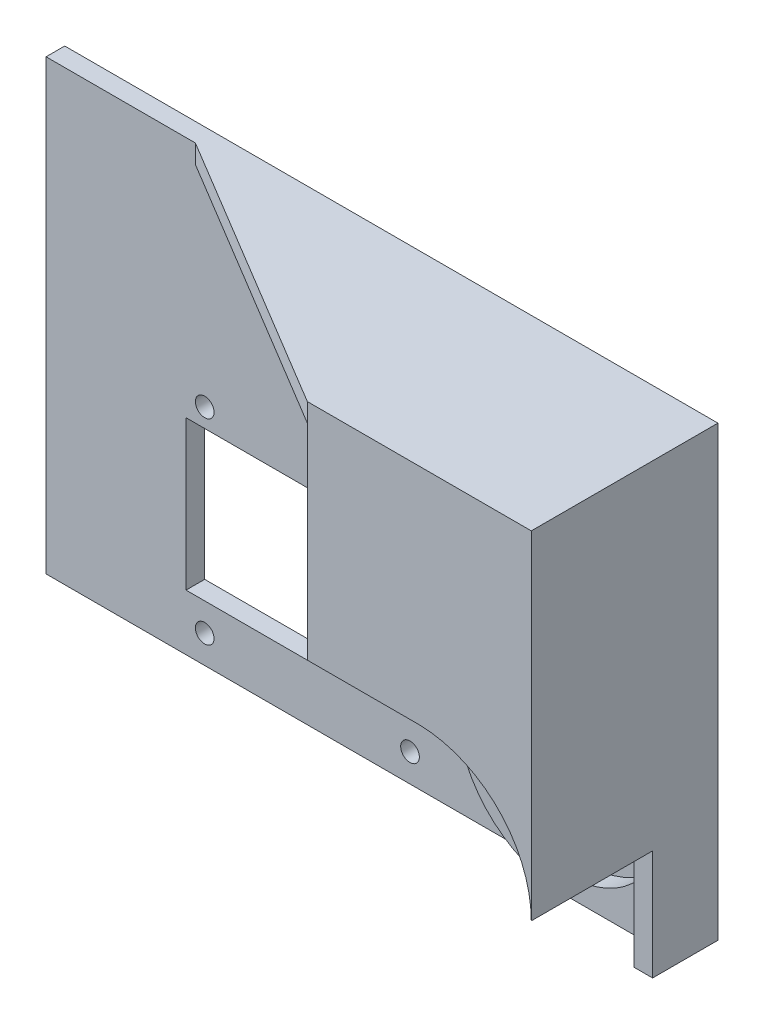
ISO-10303-21;
HEADER;
FILE_DESCRIPTION(('STEP AP214'),'2;1');
FILE_NAME('part.step','',(''),(''),'','','');
FILE_SCHEMA(('AUTOMOTIVE_DESIGN { 1 0 10303 214 1 1 1 1 }'));
ENDSEC;
DATA;
#1=APPLICATION_CONTEXT('core data for automotive mechanical design processes');
#2=APPLICATION_PROTOCOL_DEFINITION('international standard','automotive_design',2000,#1);
#3=PRODUCT_CONTEXT('',#1,'mechanical');
#4=PRODUCT('Part','Part','',(#3));
#5=PRODUCT_RELATED_PRODUCT_CATEGORY('part','',(#4));
#6=PRODUCT_DEFINITION_FORMATION('','',#4);
#7=PRODUCT_DEFINITION_CONTEXT('part definition',#1,'design');
#8=PRODUCT_DEFINITION('design','',#6,#7);
#9=PRODUCT_DEFINITION_SHAPE('','',#8);
#10=(LENGTH_UNIT() NAMED_UNIT(*) SI_UNIT(.MILLI.,.METRE.));
#11=(NAMED_UNIT(*) PLANE_ANGLE_UNIT() SI_UNIT($,.RADIAN.));
#12=(NAMED_UNIT(*) SI_UNIT($,.STERADIAN.) SOLID_ANGLE_UNIT());
#13=UNCERTAINTY_MEASURE_WITH_UNIT(LENGTH_MEASURE(1.E-05),#10,'distance_accuracy_value','');
#14=(GEOMETRIC_REPRESENTATION_CONTEXT(3) GLOBAL_UNCERTAINTY_ASSIGNED_CONTEXT((#13)) GLOBAL_UNIT_ASSIGNED_CONTEXT((#10,
#11,#12)) REPRESENTATION_CONTEXT('',''));
#15=CARTESIAN_POINT('',(0.,0.,0.));
#16=DIRECTION('',(0.,0.,1.));
#17=DIRECTION('',(1.,0.,0.));
#18=AXIS2_PLACEMENT_3D('',#15,#16,#17);
#19=CARTESIAN_POINT('',(58.,0.,2.));
#20=DIRECTION('',(-1.,0.,0.));
#21=DIRECTION('',(0.,-1.,0.));
#22=AXIS2_PLACEMENT_3D('',#19,#20,#21);
#23=PLANE('',#22);
#24=DIRECTION('',(0.,0.,1.));
#25=VECTOR('',#24,1.);
#26=CARTESIAN_POINT('',(58.,-36.2,7.));
#27=LINE('',#26,#25);
#28=CARTESIAN_POINT('',(58.,-36.2,7.));
#29=VERTEX_POINT('',#28);
#30=CARTESIAN_POINT('',(58.,-36.2,20.));
#31=VERTEX_POINT('',#30);
#32=EDGE_CURVE('E220',#29,#31,#27,.T.);
#33=ORIENTED_EDGE('',*,*,#32,.F.);
#34=DIRECTION('',(0.,1.,0.));
#35=VECTOR('',#34,1.);
#36=CARTESIAN_POINT('',(58.,-48.,7.));
#37=LINE('',#36,#35);
#38=CARTESIAN_POINT('',(58.,-48.,7.));
#39=VERTEX_POINT('',#38);
#40=EDGE_CURVE('E213',#39,#29,#37,.T.);
#41=ORIENTED_EDGE('',*,*,#40,.F.);
#42=DIRECTION('',(0.,0.,-1.));
#43=VECTOR('',#42,1.);
#44=CARTESIAN_POINT('',(58.,-48.,2.));
#45=LINE('',#44,#43);
#46=CARTESIAN_POINT('',(58.,-48.,0.));
#47=VERTEX_POINT('',#46);
#48=EDGE_CURVE('E463',#39,#47,#45,.T.);
#49=ORIENTED_EDGE('',*,*,#48,.T.);
#50=DIRECTION('',(0.,1.,0.));
#51=VECTOR('',#50,1.);
#52=CARTESIAN_POINT('',(58.,0.,0.));
#53=LINE('',#52,#51);
#54=CARTESIAN_POINT('',(58.,0.,0.));
#55=VERTEX_POINT('',#54);
#56=EDGE_CURVE('E188',#47,#55,#53,.T.);
#57=ORIENTED_EDGE('',*,*,#56,.T.);
#58=DIRECTION('',(0.,0.,-1.));
#59=VECTOR('',#58,1.);
#60=CARTESIAN_POINT('',(58.,0.,2.));
#61=LINE('',#60,#59);
#62=CARTESIAN_POINT('',(58.,0.,20.));
#63=VERTEX_POINT('',#62);
#64=EDGE_CURVE('E466',#63,#55,#61,.T.);
#65=ORIENTED_EDGE('',*,*,#64,.F.);
#66=DIRECTION('',(0.,1.,0.));
#67=VECTOR('',#66,1.);
#68=CARTESIAN_POINT('',(58.,0.,20.));
#69=LINE('',#68,#67);
#70=EDGE_CURVE('E356',#31,#63,#69,.T.);
#71=ORIENTED_EDGE('',*,*,#70,.F.);
#72=EDGE_LOOP('',(#33,#41,#49,#57,#65,#71));
#73=FACE_BOUND('',#72,.T.);
#74=ADVANCED_FACE('F36',(#73),#23,.F.);
#75=CARTESIAN_POINT('',(0.,0.,2.));
#76=DIRECTION('',(0.,0.,1.));
#77=DIRECTION('',(1.,0.,0.));
#78=AXIS2_PLACEMENT_3D('',#75,#76,#77);
#79=PLANE('',#78);
#80=CARTESIAN_POINT('',(27.,-45.,2.));
#81=DIRECTION('',(0.,0.,1.));
#82=DIRECTION('',(1.,0.,0.));
#83=AXIS2_PLACEMENT_3D('',#80,#81,#82);
#84=CIRCLE('',#83,1.);
#85=CARTESIAN_POINT('',(28.,-45.,2.));
#86=VERTEX_POINT('',#85);
#87=EDGE_CURVE('E438',#86,#86,#84,.T.);
#88=ORIENTED_EDGE('',*,*,#87,.F.);
#89=EDGE_LOOP('',(#88));
#90=FACE_BOUND('',#89,.T.);
#91=CARTESIAN_POINT('',(5.00000000000001,-24.,2.));
#92=DIRECTION('',(0.,0.,1.));
#93=DIRECTION('',(1.,0.,0.));
#94=AXIS2_PLACEMENT_3D('',#91,#92,#93);
#95=CIRCLE('',#94,1.);
#96=CARTESIAN_POINT('',(6.00000000000001,-24.,2.));
#97=VERTEX_POINT('',#96);
#98=EDGE_CURVE('E399',#97,#97,#95,.T.);
#99=ORIENTED_EDGE('',*,*,#98,.F.);
#100=EDGE_LOOP('',(#99));
#101=FACE_BOUND('',#100,.T.);
#102=CARTESIAN_POINT('',(27.,-24.,2.));
#103=DIRECTION('',(0.,0.,1.));
#104=DIRECTION('',(1.,0.,0.));
#105=AXIS2_PLACEMENT_3D('',#102,#103,#104);
#106=CIRCLE('',#105,1.);
#107=CARTESIAN_POINT('',(28.,-24.,2.));
#108=VERTEX_POINT('',#107);
#109=EDGE_CURVE('E400',#108,#108,#106,.T.);
#110=ORIENTED_EDGE('',*,*,#109,.F.);
#111=EDGE_LOOP('',(#110));
#112=FACE_BOUND('',#111,.T.);
#113=DIRECTION('',(0.,-1.,0.));
#114=VECTOR('',#113,1.);
#115=CARTESIAN_POINT('',(3.,-42.,2.));
#116=LINE('',#115,#114);
#117=CARTESIAN_POINT('',(3.,-26.,2.));
#118=VERTEX_POINT('',#117);
#119=CARTESIAN_POINT('',(3.,-42.,2.));
#120=VERTEX_POINT('',#119);
#121=EDGE_CURVE('E392',#118,#120,#116,.T.);
#122=ORIENTED_EDGE('',*,*,#121,.F.);
#123=DIRECTION('',(-1.,0.,0.));
#124=VECTOR('',#123,1.);
#125=CARTESIAN_POINT('',(3.,-26.,2.));
#126=LINE('',#125,#124);
#127=CARTESIAN_POINT('',(30.,-26.,2.));
#128=VERTEX_POINT('',#127);
#129=EDGE_CURVE('E408',#128,#118,#126,.T.);
#130=ORIENTED_EDGE('',*,*,#129,.F.);
#131=DIRECTION('',(0.,1.,0.));
#132=VECTOR('',#131,1.);
#133=CARTESIAN_POINT('',(30.,-42.,2.));
#134=LINE('',#133,#132);
#135=CARTESIAN_POINT('',(30.,-42.,2.));
#136=VERTEX_POINT('',#135);
#137=EDGE_CURVE('E422',#136,#128,#134,.T.);
#138=ORIENTED_EDGE('',*,*,#137,.F.);
#139=DIRECTION('',(1.,0.,0.));
#140=VECTOR('',#139,1.);
#141=CARTESIAN_POINT('',(3.,-42.,2.));
#142=LINE('',#141,#140);
#143=EDGE_CURVE('E419',#120,#136,#142,.T.);
#144=ORIENTED_EDGE('',*,*,#143,.F.);
#145=EDGE_LOOP('',(#122,#130,#138,#144));
#146=FACE_BOUND('',#145,.T.);
#147=CARTESIAN_POINT('',(5.00000000000001,-45.,2.));
#148=DIRECTION('',(0.,0.,1.));
#149=DIRECTION('',(1.,0.,0.));
#150=AXIS2_PLACEMENT_3D('',#147,#148,#149);
#151=CIRCLE('',#150,1.);
#152=CARTESIAN_POINT('',(6.00000000000001,-45.,2.));
#153=VERTEX_POINT('',#152);
#154=EDGE_CURVE('E437',#153,#153,#151,.T.);
#155=ORIENTED_EDGE('',*,*,#154,.F.);
#156=EDGE_LOOP('',(#155));
#157=FACE_BOUND('',#156,.T.);
#158=DIRECTION('',(1.,0.,0.));
#159=VECTOR('',#158,1.);
#160=CARTESIAN_POINT('',(0.,-48.,2.));
#161=LINE('',#160,#159);
#162=CARTESIAN_POINT('',(-12.,-48.,2.00000000000002));
#163=VERTEX_POINT('',#162);
#164=CARTESIAN_POINT('',(45.6033333333329,-48.,2.));
#165=VERTEX_POINT('',#164);
#166=EDGE_CURVE('E196',#163,#165,#161,.T.);
#167=ORIENTED_EDGE('',*,*,#166,.T.);
#168=CARTESIAN_POINT('',(45.8016666666667,-36.2,2.));
#169=DIRECTION('',(0.,0.,1.));
#170=DIRECTION('',(1.,0.,0.));
#171=AXIS2_PLACEMENT_3D('',#168,#169,#170);
#172=CIRCLE('',#171,11.8016666666667);
#173=CARTESIAN_POINT('',(34.,-36.2,2.));
#174=VERTEX_POINT('',#173);
#175=EDGE_CURVE('E234',#174,#165,#172,.T.);
#176=ORIENTED_EDGE('',*,*,#175,.F.);
#177=DIRECTION('',(-1.,0.,0.));
#178=VECTOR('',#177,1.);
#179=CARTESIAN_POINT('',(36.,-36.2,2.));
#180=LINE('',#179,#178);
#181=CARTESIAN_POINT('',(36.,-36.2,2.));
#182=VERTEX_POINT('',#181);
#183=EDGE_CURVE('E239',#182,#174,#180,.T.);
#184=ORIENTED_EDGE('',*,*,#183,.F.);
#185=CARTESIAN_POINT('',(46.,-35.9979591836735,2.));
#186=DIRECTION('',(0.,0.,-1.));
#187=DIRECTION('',(1.,0.,0.));
#188=AXIS2_PLACEMENT_3D('',#185,#186,#187);
#189=CIRCLE('',#188,10.0020408163265);
#190=CARTESIAN_POINT('',(56.,-36.2,2.));
#191=VERTEX_POINT('',#190);
#192=EDGE_CURVE('E248',#191,#182,#189,.T.);
#193=ORIENTED_EDGE('',*,*,#192,.F.);
#194=DIRECTION('',(0.,1.,0.));
#195=VECTOR('',#194,1.);
#196=CARTESIAN_POINT('',(56.,-48.,2.));
#197=LINE('',#196,#195);
#198=CARTESIAN_POINT('',(56.,-2.,2.));
#199=VERTEX_POINT('',#198);
#200=EDGE_CURVE('E377',#191,#199,#197,.T.);
#201=ORIENTED_EDGE('',*,*,#200,.T.);
#202=DIRECTION('',(1.,0.,0.));
#203=VECTOR('',#202,1.);
#204=CARTESIAN_POINT('',(4.,-2.,2.));
#205=LINE('',#204,#203);
#206=CARTESIAN_POINT('',(4.,-2.,2.));
#207=VERTEX_POINT('',#206);
#208=EDGE_CURVE('E390',#207,#199,#205,.T.);
#209=ORIENTED_EDGE('',*,*,#208,.F.);
#210=DIRECTION('',(0.,-1.,0.));
#211=VECTOR('',#210,1.);
#212=CARTESIAN_POINT('',(4.,0.,2.));
#213=LINE('',#212,#211);
#214=CARTESIAN_POINT('',(4.,0.,2.));
#215=VERTEX_POINT('',#214);
#216=EDGE_CURVE('E387',#215,#207,#213,.T.);
#217=ORIENTED_EDGE('',*,*,#216,.F.);
#218=DIRECTION('',(-1.,0.,0.));
#219=VECTOR('',#218,1.);
#220=CARTESIAN_POINT('',(0.,0.,2.));
#221=LINE('',#220,#219);
#222=CARTESIAN_POINT('',(-12.,0.,2.00000000000002));
#223=VERTEX_POINT('',#222);
#224=EDGE_CURVE('E452',#215,#223,#221,.T.);
#225=ORIENTED_EDGE('',*,*,#224,.T.);
#226=DIRECTION('',(0.,1.,0.));
#227=VECTOR('',#226,1.);
#228=CARTESIAN_POINT('',(-12.,0.,2.00000000000002));
#229=LINE('',#228,#227);
#230=EDGE_CURVE('E200',#163,#223,#229,.T.);
#231=ORIENTED_EDGE('',*,*,#230,.F.);
#232=EDGE_LOOP('',(#167,#176,#184,#193,#201,#209,#217,#225,#231));
#233=FACE_BOUND('',#232,.T.);
#234=ADVANCED_FACE('F286',(#90,#101,#112,#146,#157,#233),#79,.T.);
#235=CARTESIAN_POINT('',(56.,-48.,18.));
#236=DIRECTION('',(1.,0.,0.));
#237=DIRECTION('',(0.,1.,0.));
#238=AXIS2_PLACEMENT_3D('',#235,#236,#237);
#239=PLANE('',#238);
#240=DIRECTION('',(0.,1.,0.));
#241=VECTOR('',#240,1.);
#242=CARTESIAN_POINT('',(56.,-48.,7.));
#243=LINE('',#242,#241);
#244=CARTESIAN_POINT('',(56.,-48.,7.));
#245=VERTEX_POINT('',#244);
#246=CARTESIAN_POINT('',(56.,-29.5062217943327,7.));
#247=VERTEX_POINT('',#246);
#248=EDGE_CURVE('E231',#245,#247,#243,.T.);
#249=ORIENTED_EDGE('',*,*,#248,.T.);
#250=DIRECTION('',(0.,0.,1.));
#251=VECTOR('',#250,1.);
#252=CARTESIAN_POINT('',(56.,-29.5062217943327,7.));
#253=LINE('',#252,#251);
#254=CARTESIAN_POINT('',(56.,-29.5062217943327,18.));
#255=VERTEX_POINT('',#254);
#256=EDGE_CURVE('E226',#247,#255,#253,.T.);
#257=ORIENTED_EDGE('',*,*,#256,.T.);
#258=DIRECTION('',(0.,1.,0.));
#259=VECTOR('',#258,1.);
#260=CARTESIAN_POINT('',(56.,-48.,18.));
#261=LINE('',#260,#259);
#262=CARTESIAN_POINT('',(56.,-2.,18.));
#263=VERTEX_POINT('',#262);
#264=EDGE_CURVE('E373',#255,#263,#261,.T.);
#265=ORIENTED_EDGE('',*,*,#264,.T.);
#266=DIRECTION('',(0.,0.,-1.));
#267=VECTOR('',#266,1.);
#268=CARTESIAN_POINT('',(56.,-2.,18.));
#269=LINE('',#268,#267);
#270=EDGE_CURVE('E480',#263,#199,#269,.T.);
#271=ORIENTED_EDGE('',*,*,#270,.T.);
#272=ORIENTED_EDGE('',*,*,#200,.F.);
#273=DIRECTION('',(0.,0.,-1.));
#274=VECTOR('',#273,1.);
#275=CARTESIAN_POINT('',(56.,-36.2,4.));
#276=LINE('',#275,#274);
#277=CARTESIAN_POINT('',(56.,-36.2,4.));
#278=VERTEX_POINT('',#277);
#279=EDGE_CURVE('E253',#278,#191,#276,.T.);
#280=ORIENTED_EDGE('',*,*,#279,.F.);
#281=DIRECTION('',(0.,-1.,0.));
#282=VECTOR('',#281,1.);
#283=CARTESIAN_POINT('',(56.,-48.,4.));
#284=LINE('',#283,#282);
#285=CARTESIAN_POINT('',(56.,-48.,4.));
#286=VERTEX_POINT('',#285);
#287=EDGE_CURVE('E460',#278,#286,#284,.T.);
#288=ORIENTED_EDGE('',*,*,#287,.T.);
#289=DIRECTION('',(0.,0.,-1.));
#290=VECTOR('',#289,1.);
#291=CARTESIAN_POINT('',(56.,-48.,18.));
#292=LINE('',#291,#290);
#293=EDGE_CURVE('E60',#245,#286,#292,.T.);
#294=ORIENTED_EDGE('',*,*,#293,.F.);
#295=EDGE_LOOP('',(#249,#257,#265,#271,#272,#280,#288,#294));
#296=FACE_BOUND('',#295,.T.);
#297=ADVANCED_FACE('F282',(#296),#239,.F.);
#298=CARTESIAN_POINT('',(4.,-2.,20.));
#299=DIRECTION('',(0.,1.,0.));
#300=DIRECTION('',(-1.,0.,0.));
#301=AXIS2_PLACEMENT_3D('',#298,#299,#300);
#302=PLANE('',#301);
#303=DIRECTION('',(0.,0.,-1.));
#304=VECTOR('',#303,1.);
#305=CARTESIAN_POINT('',(34.,-2.,20.));
#306=LINE('',#305,#304);
#307=CARTESIAN_POINT('',(34.,-2.,20.));
#308=VERTEX_POINT('',#307);
#309=CARTESIAN_POINT('',(34.,-2.,18.));
#310=VERTEX_POINT('',#309);
#311=EDGE_CURVE('E370',#308,#310,#306,.T.);
#312=ORIENTED_EDGE('',*,*,#311,.F.);
#313=DIRECTION('',(-0.857492925712544,0.,-0.514495755427526));
#314=VECTOR('',#313,1.);
#315=CARTESIAN_POINT('',(4.,-2.,2.));
#316=LINE('',#315,#314);
#317=EDGE_CURVE('E381',#308,#207,#316,.T.);
#318=ORIENTED_EDGE('',*,*,#317,.T.);
#319=ORIENTED_EDGE('',*,*,#208,.T.);
#320=ORIENTED_EDGE('',*,*,#270,.F.);
#321=DIRECTION('',(1.,0.,0.));
#322=VECTOR('',#321,1.);
#323=CARTESIAN_POINT('',(56.,-2.,18.));
#324=LINE('',#323,#322);
#325=EDGE_CURVE('E482',#310,#263,#324,.T.);
#326=ORIENTED_EDGE('',*,*,#325,.F.);
#327=EDGE_LOOP('',(#312,#318,#319,#320,#326));
#328=FACE_BOUND('',#327,.T.);
#329=ADVANCED_FACE('F285',(#328),#302,.F.);
#330=CARTESIAN_POINT('',(0.,-48.,2.));
#331=DIRECTION('',(0.,1.,0.));
#332=DIRECTION('',(0.,0.,1.));
#333=AXIS2_PLACEMENT_3D('',#330,#331,#332);
#334=PLANE('',#333);
#335=ORIENTED_EDGE('',*,*,#48,.F.);
#336=DIRECTION('',(1.,0.,0.));
#337=VECTOR('',#336,1.);
#338=CARTESIAN_POINT('',(58.,-48.,7.));
#339=LINE('',#338,#337);
#340=EDGE_CURVE('E211',#245,#39,#339,.T.);
#341=ORIENTED_EDGE('',*,*,#340,.F.);
#342=ORIENTED_EDGE('',*,*,#293,.T.);
#343=DIRECTION('',(1.,0.,0.));
#344=VECTOR('',#343,1.);
#345=CARTESIAN_POINT('',(57.,-48.,4.));
#346=LINE('',#345,#344);
#347=CARTESIAN_POINT('',(46.,-48.,4.));
#348=VERTEX_POINT('',#347);
#349=EDGE_CURVE('E238',#348,#286,#346,.T.);
#350=ORIENTED_EDGE('',*,*,#349,.F.);
#351=DIRECTION('',(0.,0.,-1.));
#352=VECTOR('',#351,1.);
#353=CARTESIAN_POINT('',(46.,-48.,4.));
#354=LINE('',#353,#352);
#355=CARTESIAN_POINT('',(46.,-48.,2.));
#356=VERTEX_POINT('',#355);
#357=EDGE_CURVE('E255',#348,#356,#354,.T.);
#358=ORIENTED_EDGE('',*,*,#357,.T.);
#359=CARTESIAN_POINT('',(45.8016666666667,-36.2,2.));
#360=DIRECTION('',(0.,0.,1.));
#361=DIRECTION('',(-0.0168055359412902,-0.999858777008896,0.));
#362=AXIS2_PLACEMENT_3D('',#359,#360,#361);
#363=CIRCLE('',#362,11.8016666666667);
#364=EDGE_CURVE('E258',#165,#356,#363,.T.);
#365=ORIENTED_EDGE('',*,*,#364,.F.);
#366=ORIENTED_EDGE('',*,*,#166,.F.);
#367=DIRECTION('',(0.,0.,1.));
#368=VECTOR('',#367,1.);
#369=CARTESIAN_POINT('',(-12.,-48.,0.));
#370=LINE('',#369,#368);
#371=CARTESIAN_POINT('',(-12.,-48.,0.));
#372=VERTEX_POINT('',#371);
#373=EDGE_CURVE('E193',#372,#163,#370,.T.);
#374=ORIENTED_EDGE('',*,*,#373,.F.);
#375=DIRECTION('',(1.,0.,0.));
#376=VECTOR('',#375,1.);
#377=CARTESIAN_POINT('',(0.,-48.,0.));
#378=LINE('',#377,#376);
#379=EDGE_CURVE('E182',#372,#47,#378,.T.);
#380=ORIENTED_EDGE('',*,*,#379,.T.);
#381=EDGE_LOOP('',(#335,#341,#342,#350,#358,#365,#366,#374,#380));
#382=FACE_BOUND('',#381,.T.);
#383=ADVANCED_FACE('F38',(#382),#334,.F.);
#384=CARTESIAN_POINT('',(0.,0.,2.));
#385=DIRECTION('',(0.,-1.,0.));
#386=DIRECTION('',(0.,0.,-1.));
#387=AXIS2_PLACEMENT_3D('',#384,#385,#386);
#388=PLANE('',#387);
#389=ORIENTED_EDGE('',*,*,#224,.F.);
#390=DIRECTION('',(-0.857492925712544,0.,-0.514495755427526));
#391=VECTOR('',#390,1.);
#392=CARTESIAN_POINT('',(4.,0.,2.));
#393=LINE('',#392,#391);
#394=CARTESIAN_POINT('',(34.,0.,20.));
#395=VERTEX_POINT('',#394);
#396=EDGE_CURVE('E375',#395,#215,#393,.T.);
#397=ORIENTED_EDGE('',*,*,#396,.F.);
#398=DIRECTION('',(-1.,0.,0.));
#399=VECTOR('',#398,1.);
#400=CARTESIAN_POINT('',(4.,0.,20.));
#401=LINE('',#400,#399);
#402=EDGE_CURVE('E389',#63,#395,#401,.T.);
#403=ORIENTED_EDGE('',*,*,#402,.F.);
#404=ORIENTED_EDGE('',*,*,#64,.T.);
#405=DIRECTION('',(-1.,0.,0.));
#406=VECTOR('',#405,1.);
#407=CARTESIAN_POINT('',(0.,0.,0.));
#408=LINE('',#407,#406);
#409=CARTESIAN_POINT('',(-12.,0.,0.));
#410=VERTEX_POINT('',#409);
#411=EDGE_CURVE('E455',#55,#410,#408,.T.);
#412=ORIENTED_EDGE('',*,*,#411,.T.);
#413=DIRECTION('',(0.,0.,-1.));
#414=VECTOR('',#413,1.);
#415=CARTESIAN_POINT('',(-12.,0.,0.));
#416=LINE('',#415,#414);
#417=EDGE_CURVE('E205',#223,#410,#416,.T.);
#418=ORIENTED_EDGE('',*,*,#417,.F.);
#419=EDGE_LOOP('',(#389,#397,#403,#404,#412,#418));
#420=FACE_BOUND('',#419,.T.);
#421=ADVANCED_FACE('F344',(#420),#388,.F.);
#422=CARTESIAN_POINT('',(0.,0.,0.));
#423=DIRECTION('',(0.,0.,1.));
#424=DIRECTION('',(1.,0.,0.));
#425=AXIS2_PLACEMENT_3D('',#422,#423,#424);
#426=PLANE('',#425);
#427=CARTESIAN_POINT('',(27.,-45.,0.));
#428=DIRECTION('',(0.,0.,1.));
#429=DIRECTION('',(1.,0.,0.));
#430=AXIS2_PLACEMENT_3D('',#427,#428,#429);
#431=CIRCLE('',#430,1.);
#432=CARTESIAN_POINT('',(28.,-45.,0.));
#433=VERTEX_POINT('',#432);
#434=EDGE_CURVE('E434',#433,#433,#431,.T.);
#435=ORIENTED_EDGE('',*,*,#434,.T.);
#436=EDGE_LOOP('',(#435));
#437=FACE_BOUND('',#436,.T.);
#438=CARTESIAN_POINT('',(5.00000000000001,-24.,0.));
#439=DIRECTION('',(0.,0.,1.));
#440=DIRECTION('',(1.,0.,0.));
#441=AXIS2_PLACEMENT_3D('',#438,#439,#440);
#442=CIRCLE('',#441,1.);
#443=CARTESIAN_POINT('',(6.00000000000001,-24.,0.));
#444=VERTEX_POINT('',#443);
#445=EDGE_CURVE('E441',#444,#444,#442,.T.);
#446=ORIENTED_EDGE('',*,*,#445,.T.);
#447=EDGE_LOOP('',(#446));
#448=FACE_BOUND('',#447,.T.);
#449=CARTESIAN_POINT('',(27.,-24.,0.));
#450=DIRECTION('',(0.,0.,1.));
#451=DIRECTION('',(1.,0.,0.));
#452=AXIS2_PLACEMENT_3D('',#449,#450,#451);
#453=CIRCLE('',#452,1.);
#454=CARTESIAN_POINT('',(28.,-24.,0.));
#455=VERTEX_POINT('',#454);
#456=EDGE_CURVE('E396',#455,#455,#453,.T.);
#457=ORIENTED_EDGE('',*,*,#456,.T.);
#458=EDGE_LOOP('',(#457));
#459=FACE_BOUND('',#458,.T.);
#460=DIRECTION('',(-1.,0.,0.));
#461=VECTOR('',#460,1.);
#462=CARTESIAN_POINT('',(3.,-26.,0.));
#463=LINE('',#462,#461);
#464=CARTESIAN_POINT('',(30.,-26.,0.));
#465=VERTEX_POINT('',#464);
#466=CARTESIAN_POINT('',(3.,-26.,0.));
#467=VERTEX_POINT('',#466);
#468=EDGE_CURVE('E414',#465,#467,#463,.T.);
#469=ORIENTED_EDGE('',*,*,#468,.T.);
#470=DIRECTION('',(0.,-1.,0.));
#471=VECTOR('',#470,1.);
#472=CARTESIAN_POINT('',(3.,-42.,0.));
#473=LINE('',#472,#471);
#474=CARTESIAN_POINT('',(3.,-42.,0.));
#475=VERTEX_POINT('',#474);
#476=EDGE_CURVE('E404',#467,#475,#473,.T.);
#477=ORIENTED_EDGE('',*,*,#476,.T.);
#478=DIRECTION('',(1.,0.,0.));
#479=VECTOR('',#478,1.);
#480=CARTESIAN_POINT('',(3.,-42.,0.));
#481=LINE('',#480,#479);
#482=CARTESIAN_POINT('',(30.,-42.,0.));
#483=VERTEX_POINT('',#482);
#484=EDGE_CURVE('E407',#475,#483,#481,.T.);
#485=ORIENTED_EDGE('',*,*,#484,.T.);
#486=DIRECTION('',(0.,1.,0.));
#487=VECTOR('',#486,1.);
#488=CARTESIAN_POINT('',(30.,-42.,0.));
#489=LINE('',#488,#487);
#490=EDGE_CURVE('E411',#483,#465,#489,.T.);
#491=ORIENTED_EDGE('',*,*,#490,.T.);
#492=EDGE_LOOP('',(#469,#477,#485,#491));
#493=FACE_BOUND('',#492,.T.);
#494=CARTESIAN_POINT('',(5.00000000000001,-45.,0.));
#495=DIRECTION('',(0.,0.,1.));
#496=DIRECTION('',(1.,0.,0.));
#497=AXIS2_PLACEMENT_3D('',#494,#495,#496);
#498=CIRCLE('',#497,1.);
#499=CARTESIAN_POINT('',(6.00000000000001,-45.,0.));
#500=VERTEX_POINT('',#499);
#501=EDGE_CURVE('E190',#500,#500,#498,.T.);
#502=ORIENTED_EDGE('',*,*,#501,.T.);
#503=EDGE_LOOP('',(#502));
#504=FACE_BOUND('',#503,.T.);
#505=ORIENTED_EDGE('',*,*,#379,.F.);
#506=DIRECTION('',(0.,-1.,0.));
#507=VECTOR('',#506,1.);
#508=CARTESIAN_POINT('',(-12.,0.,0.));
#509=LINE('',#508,#507);
#510=EDGE_CURVE('E187',#410,#372,#509,.T.);
#511=ORIENTED_EDGE('',*,*,#510,.F.);
#512=ORIENTED_EDGE('',*,*,#411,.F.);
#513=ORIENTED_EDGE('',*,*,#56,.F.);
#514=EDGE_LOOP('',(#505,#511,#512,#513));
#515=FACE_BOUND('',#514,.T.);
#516=ADVANCED_FACE('F184',(#437,#448,#459,#493,#504,#515),#426,.F.);
#517=CARTESIAN_POINT('',(5.00000000000001,-45.,0.));
#518=DIRECTION('',(0.,0.,1.));
#519=DIRECTION('',(1.,0.,0.));
#520=AXIS2_PLACEMENT_3D('',#517,#518,#519);
#521=CYLINDRICAL_SURFACE('',#520,1.);
#522=ORIENTED_EDGE('',*,*,#501,.F.);
#523=EDGE_LOOP('',(#522));
#524=FACE_BOUND('',#523,.T.);
#525=ORIENTED_EDGE('',*,*,#154,.T.);
#526=EDGE_LOOP('',(#525));
#527=FACE_BOUND('',#526,.T.);
#528=ADVANCED_FACE('F328',(#524,#527),#521,.F.);
#529=CARTESIAN_POINT('',(3.,-42.,0.));
#530=DIRECTION('',(-1.,0.,0.));
#531=DIRECTION('',(0.,0.,1.));
#532=AXIS2_PLACEMENT_3D('',#529,#530,#531);
#533=PLANE('',#532);
#534=ORIENTED_EDGE('',*,*,#121,.T.);
#535=DIRECTION('',(0.,0.,1.));
#536=VECTOR('',#535,1.);
#537=CARTESIAN_POINT('',(3.,-42.,0.));
#538=LINE('',#537,#536);
#539=EDGE_CURVE('E417',#475,#120,#538,.T.);
#540=ORIENTED_EDGE('',*,*,#539,.F.);
#541=ORIENTED_EDGE('',*,*,#476,.F.);
#542=DIRECTION('',(0.,0.,1.));
#543=VECTOR('',#542,1.);
#544=CARTESIAN_POINT('',(3.,-26.,0.));
#545=LINE('',#544,#543);
#546=EDGE_CURVE('E403',#467,#118,#545,.T.);
#547=ORIENTED_EDGE('',*,*,#546,.T.);
#548=EDGE_LOOP('',(#534,#540,#541,#547));
#549=FACE_BOUND('',#548,.T.);
#550=ADVANCED_FACE('F318',(#549),#533,.F.);
#551=CARTESIAN_POINT('',(3.,-26.,0.));
#552=DIRECTION('',(0.,1.,0.));
#553=DIRECTION('',(0.,0.,1.));
#554=AXIS2_PLACEMENT_3D('',#551,#552,#553);
#555=PLANE('',#554);
#556=ORIENTED_EDGE('',*,*,#129,.T.);
#557=ORIENTED_EDGE('',*,*,#546,.F.);
#558=ORIENTED_EDGE('',*,*,#468,.F.);
#559=DIRECTION('',(0.,0.,1.));
#560=VECTOR('',#559,1.);
#561=CARTESIAN_POINT('',(30.,-26.,0.));
#562=LINE('',#561,#560);
#563=EDGE_CURVE('E428',#465,#128,#562,.T.);
#564=ORIENTED_EDGE('',*,*,#563,.T.);
#565=EDGE_LOOP('',(#556,#557,#558,#564));
#566=FACE_BOUND('',#565,.T.);
#567=ADVANCED_FACE('F314',(#566),#555,.F.);
#568=CARTESIAN_POINT('',(30.,-42.,0.));
#569=DIRECTION('',(1.,0.,0.));
#570=DIRECTION('',(0.,0.,-1.));
#571=AXIS2_PLACEMENT_3D('',#568,#569,#570);
#572=PLANE('',#571);
#573=ORIENTED_EDGE('',*,*,#137,.T.);
#574=ORIENTED_EDGE('',*,*,#563,.F.);
#575=ORIENTED_EDGE('',*,*,#490,.F.);
#576=DIRECTION('',(0.,0.,1.));
#577=VECTOR('',#576,1.);
#578=CARTESIAN_POINT('',(30.,-42.,0.));
#579=LINE('',#578,#577);
#580=EDGE_CURVE('E430',#483,#136,#579,.T.);
#581=ORIENTED_EDGE('',*,*,#580,.T.);
#582=EDGE_LOOP('',(#573,#574,#575,#581));
#583=FACE_BOUND('',#582,.T.);
#584=ADVANCED_FACE('F317',(#583),#572,.F.);
#585=CARTESIAN_POINT('',(3.,-42.,0.));
#586=DIRECTION('',(0.,-1.,0.));
#587=DIRECTION('',(0.,0.,-1.));
#588=AXIS2_PLACEMENT_3D('',#585,#586,#587);
#589=PLANE('',#588);
#590=ORIENTED_EDGE('',*,*,#143,.T.);
#591=ORIENTED_EDGE('',*,*,#580,.F.);
#592=ORIENTED_EDGE('',*,*,#484,.F.);
#593=ORIENTED_EDGE('',*,*,#539,.T.);
#594=EDGE_LOOP('',(#590,#591,#592,#593));
#595=FACE_BOUND('',#594,.T.);
#596=ADVANCED_FACE('F312',(#595),#589,.F.);
#597=CARTESIAN_POINT('',(27.,-24.,0.));
#598=DIRECTION('',(0.,0.,1.));
#599=DIRECTION('',(1.,0.,0.));
#600=AXIS2_PLACEMENT_3D('',#597,#598,#599);
#601=CYLINDRICAL_SURFACE('',#600,1.);
#602=ORIENTED_EDGE('',*,*,#456,.F.);
#603=EDGE_LOOP('',(#602));
#604=FACE_BOUND('',#603,.T.);
#605=ORIENTED_EDGE('',*,*,#109,.T.);
#606=EDGE_LOOP('',(#605));
#607=FACE_BOUND('',#606,.T.);
#608=ADVANCED_FACE('F308',(#604,#607),#601,.F.);
#609=CARTESIAN_POINT('',(5.00000000000001,-24.,0.));
#610=DIRECTION('',(0.,0.,1.));
#611=DIRECTION('',(1.,0.,0.));
#612=AXIS2_PLACEMENT_3D('',#609,#610,#611);
#613=CYLINDRICAL_SURFACE('',#612,1.);
#614=ORIENTED_EDGE('',*,*,#445,.F.);
#615=EDGE_LOOP('',(#614));
#616=FACE_BOUND('',#615,.T.);
#617=ORIENTED_EDGE('',*,*,#98,.T.);
#618=EDGE_LOOP('',(#617));
#619=FACE_BOUND('',#618,.T.);
#620=ADVANCED_FACE('F311',(#616,#619),#613,.F.);
#621=CARTESIAN_POINT('',(27.,-45.,0.));
#622=DIRECTION('',(0.,0.,1.));
#623=DIRECTION('',(1.,0.,0.));
#624=AXIS2_PLACEMENT_3D('',#621,#622,#623);
#625=CYLINDRICAL_SURFACE('',#624,1.);
#626=ORIENTED_EDGE('',*,*,#434,.F.);
#627=EDGE_LOOP('',(#626));
#628=FACE_BOUND('',#627,.T.);
#629=ORIENTED_EDGE('',*,*,#87,.T.);
#630=EDGE_LOOP('',(#629));
#631=FACE_BOUND('',#630,.T.);
#632=ADVANCED_FACE('F303',(#628,#631),#625,.F.);
#633=CARTESIAN_POINT('',(0.,0.,20.));
#634=DIRECTION('',(0.,0.,1.));
#635=DIRECTION('',(1.,0.,0.));
#636=AXIS2_PLACEMENT_3D('',#633,#634,#635);
#637=PLANE('',#636);
#638=DIRECTION('',(-1.,0.,0.));
#639=VECTOR('',#638,1.);
#640=CARTESIAN_POINT('',(34.,-24.,20.));
#641=LINE('',#640,#639);
#642=CARTESIAN_POINT('',(46.,-24.,20.));
#643=VERTEX_POINT('',#642);
#644=CARTESIAN_POINT('',(34.,-24.,20.));
#645=VERTEX_POINT('',#644);
#646=EDGE_CURVE('E214',#643,#645,#641,.T.);
#647=ORIENTED_EDGE('',*,*,#646,.F.);
#648=CARTESIAN_POINT('',(45.7983333333333,-36.2,20.));
#649=DIRECTION('',(0.,0.,1.));
#650=DIRECTION('',(-1.,0.,0.));
#651=AXIS2_PLACEMENT_3D('',#648,#649,#650);
#652=CIRCLE('',#651,12.2016666666667);
#653=EDGE_CURVE('E210',#31,#643,#652,.T.);
#654=ORIENTED_EDGE('',*,*,#653,.F.);
#655=ORIENTED_EDGE('',*,*,#70,.T.);
#656=ORIENTED_EDGE('',*,*,#402,.T.);
#657=DIRECTION('',(0.,1.,0.));
#658=VECTOR('',#657,1.);
#659=CARTESIAN_POINT('',(34.,-2.,20.));
#660=LINE('',#659,#658);
#661=EDGE_CURVE('E384',#308,#395,#660,.T.);
#662=ORIENTED_EDGE('',*,*,#661,.F.);
#663=DIRECTION('',(0.,1.,0.));
#664=VECTOR('',#663,1.);
#665=CARTESIAN_POINT('',(34.,-48.,20.));
#666=LINE('',#665,#664);
#667=EDGE_CURVE('E363',#645,#308,#666,.T.);
#668=ORIENTED_EDGE('',*,*,#667,.F.);
#669=EDGE_LOOP('',(#647,#654,#655,#656,#662,#668));
#670=FACE_BOUND('',#669,.T.);
#671=ADVANCED_FACE('F299',(#670),#637,.T.);
#672=CARTESIAN_POINT('',(4.,-2.,2.));
#673=DIRECTION('',(0.514495755427526,0.,-0.857492925712544));
#674=DIRECTION('',(-0.857492925712544,0.,-0.514495755427526));
#675=AXIS2_PLACEMENT_3D('',#672,#673,#674);
#676=PLANE('',#675);
#677=ORIENTED_EDGE('',*,*,#396,.T.);
#678=ORIENTED_EDGE('',*,*,#216,.T.);
#679=ORIENTED_EDGE('',*,*,#317,.F.);
#680=ORIENTED_EDGE('',*,*,#661,.T.);
#681=EDGE_LOOP('',(#677,#678,#679,#680));
#682=FACE_BOUND('',#681,.T.);
#683=ADVANCED_FACE('F295',(#682),#676,.F.);
#684=CARTESIAN_POINT('',(34.,-48.,20.));
#685=DIRECTION('',(1.,0.,0.));
#686=DIRECTION('',(0.,1.,0.));
#687=AXIS2_PLACEMENT_3D('',#684,#685,#686);
#688=PLANE('',#687);
#689=DIRECTION('',(0.,1.,0.));
#690=VECTOR('',#689,1.);
#691=CARTESIAN_POINT('',(34.,-48.,18.));
#692=LINE('',#691,#690);
#693=CARTESIAN_POINT('',(34.,-24.,18.));
#694=VERTEX_POINT('',#693);
#695=EDGE_CURVE('E369',#694,#310,#692,.T.);
#696=ORIENTED_EDGE('',*,*,#695,.F.);
#697=DIRECTION('',(0.,0.,1.));
#698=VECTOR('',#697,1.);
#699=CARTESIAN_POINT('',(34.,-24.,7.));
#700=LINE('',#699,#698);
#701=EDGE_CURVE('E223',#694,#645,#700,.T.);
#702=ORIENTED_EDGE('',*,*,#701,.T.);
#703=ORIENTED_EDGE('',*,*,#667,.T.);
#704=ORIENTED_EDGE('',*,*,#311,.T.);
#705=EDGE_LOOP('',(#696,#702,#703,#704));
#706=FACE_BOUND('',#705,.T.);
#707=ADVANCED_FACE('F291',(#706),#688,.F.);
#708=CARTESIAN_POINT('',(56.,-48.,18.));
#709=DIRECTION('',(0.,0.,1.));
#710=DIRECTION('',(1.,0.,0.));
#711=AXIS2_PLACEMENT_3D('',#708,#709,#710);
#712=PLANE('',#711);
#713=CARTESIAN_POINT('',(45.7983333333333,-36.2,18.));
#714=DIRECTION('',(0.,0.,1.));
#715=DIRECTION('',(1.,0.,0.));
#716=AXIS2_PLACEMENT_3D('',#713,#714,#715);
#717=CIRCLE('',#716,12.2016666666667);
#718=CARTESIAN_POINT('',(46.,-24.,18.));
#719=VERTEX_POINT('',#718);
#720=EDGE_CURVE('E45',#255,#719,#717,.T.);
#721=ORIENTED_EDGE('',*,*,#720,.T.);
#722=DIRECTION('',(-1.,0.,0.));
#723=VECTOR('',#722,1.);
#724=CARTESIAN_POINT('',(56.,-24.,18.));
#725=LINE('',#724,#723);
#726=EDGE_CURVE('E11',#719,#694,#725,.T.);
#727=ORIENTED_EDGE('',*,*,#726,.T.);
#728=ORIENTED_EDGE('',*,*,#695,.T.);
#729=ORIENTED_EDGE('',*,*,#325,.T.);
#730=ORIENTED_EDGE('',*,*,#264,.F.);
#731=EDGE_LOOP('',(#721,#727,#728,#729,#730));
#732=FACE_BOUND('',#731,.T.);
#733=ADVANCED_FACE('F288',(#732),#712,.F.);
#734=CARTESIAN_POINT('',(45.8016666666667,-36.2,4.));
#735=DIRECTION('',(0.,0.,1.));
#736=DIRECTION('',(1.,0.,0.));
#737=AXIS2_PLACEMENT_3D('',#734,#735,#736);
#738=PLANE('',#737);
#739=ORIENTED_EDGE('',*,*,#287,.F.);
#740=CARTESIAN_POINT('',(46.,-35.9979591836735,4.));
#741=DIRECTION('',(0.,0.,-1.));
#742=DIRECTION('',(1.,0.,0.));
#743=AXIS2_PLACEMENT_3D('',#740,#741,#742);
#744=CIRCLE('',#743,10.0020408163265);
#745=CARTESIAN_POINT('',(36.,-36.2,4.));
#746=VERTEX_POINT('',#745);
#747=EDGE_CURVE('E241',#278,#746,#744,.T.);
#748=ORIENTED_EDGE('',*,*,#747,.T.);
#749=DIRECTION('',(-1.,0.,0.));
#750=VECTOR('',#749,1.);
#751=CARTESIAN_POINT('',(36.,-36.2,4.));
#752=LINE('',#751,#750);
#753=CARTESIAN_POINT('',(34.,-36.2,4.));
#754=VERTEX_POINT('',#753);
#755=EDGE_CURVE('E243',#746,#754,#752,.T.);
#756=ORIENTED_EDGE('',*,*,#755,.T.);
#757=CARTESIAN_POINT('',(45.8016666666667,-36.2,4.));
#758=DIRECTION('',(0.,0.,1.));
#759=DIRECTION('',(1.,0.,0.));
#760=AXIS2_PLACEMENT_3D('',#757,#758,#759);
#761=CIRCLE('',#760,11.8016666666667);
#762=EDGE_CURVE('E235',#754,#348,#761,.T.);
#763=ORIENTED_EDGE('',*,*,#762,.T.);
#764=ORIENTED_EDGE('',*,*,#349,.T.);
#765=EDGE_LOOP('',(#739,#748,#756,#763,#764));
#766=FACE_BOUND('',#765,.T.);
#767=ADVANCED_FACE('F280',(#766),#738,.T.);
#768=CARTESIAN_POINT('',(45.8016666666667,-36.2,4.));
#769=DIRECTION('',(0.,0.,-1.));
#770=DIRECTION('',(-1.,0.,0.));
#771=AXIS2_PLACEMENT_3D('',#768,#769,#770);
#772=CYLINDRICAL_SURFACE('',#771,11.8016666666667);
#773=ORIENTED_EDGE('',*,*,#175,.T.);
#774=ORIENTED_EDGE('',*,*,#364,.T.);
#775=ORIENTED_EDGE('',*,*,#357,.F.);
#776=ORIENTED_EDGE('',*,*,#762,.F.);
#777=DIRECTION('',(0.,0.,-1.));
#778=VECTOR('',#777,1.);
#779=CARTESIAN_POINT('',(34.,-36.2,4.));
#780=LINE('',#779,#778);
#781=EDGE_CURVE('E245',#754,#174,#780,.T.);
#782=ORIENTED_EDGE('',*,*,#781,.T.);
#783=EDGE_LOOP('',(#773,#774,#775,#776,#782));
#784=FACE_BOUND('',#783,.T.);
#785=ADVANCED_FACE('F269',(#784),#772,.T.);
#786=CARTESIAN_POINT('',(46.,-35.9979591836735,4.));
#787=DIRECTION('',(0.,0.,-1.));
#788=DIRECTION('',(-1.,0.,0.));
#789=AXIS2_PLACEMENT_3D('',#786,#787,#788);
#790=CYLINDRICAL_SURFACE('',#789,10.0020408163265);
#791=ORIENTED_EDGE('',*,*,#192,.T.);
#792=DIRECTION('',(0.,0.,-1.));
#793=VECTOR('',#792,1.);
#794=CARTESIAN_POINT('',(36.,-36.2,4.));
#795=LINE('',#794,#793);
#796=EDGE_CURVE('E492',#746,#182,#795,.T.);
#797=ORIENTED_EDGE('',*,*,#796,.F.);
#798=ORIENTED_EDGE('',*,*,#747,.F.);
#799=ORIENTED_EDGE('',*,*,#279,.T.);
#800=EDGE_LOOP('',(#791,#797,#798,#799));
#801=FACE_BOUND('',#800,.T.);
#802=ADVANCED_FACE('F279',(#801),#790,.F.);
#803=CARTESIAN_POINT('',(36.,-36.2,4.));
#804=DIRECTION('',(0.,-1.,0.));
#805=DIRECTION('',(0.,0.,-1.));
#806=AXIS2_PLACEMENT_3D('',#803,#804,#805);
#807=PLANE('',#806);
#808=ORIENTED_EDGE('',*,*,#183,.T.);
#809=ORIENTED_EDGE('',*,*,#781,.F.);
#810=ORIENTED_EDGE('',*,*,#755,.F.);
#811=ORIENTED_EDGE('',*,*,#796,.T.);
#812=EDGE_LOOP('',(#808,#809,#810,#811));
#813=FACE_BOUND('',#812,.T.);
#814=ADVANCED_FACE('F500',(#813),#807,.F.);
#815=CARTESIAN_POINT('',(45.7983333333333,-36.2,7.));
#816=DIRECTION('',(0.,0.,-1.));
#817=DIRECTION('',(-1.,0.,0.));
#818=AXIS2_PLACEMENT_3D('',#815,#816,#817);
#819=PLANE('',#818);
#820=ORIENTED_EDGE('',*,*,#340,.T.);
#821=ORIENTED_EDGE('',*,*,#40,.T.);
#822=CARTESIAN_POINT('',(45.7983333333333,-36.2,7.));
#823=DIRECTION('',(0.,0.,1.));
#824=DIRECTION('',(-1.,0.,0.));
#825=AXIS2_PLACEMENT_3D('',#822,#823,#824);
#826=CIRCLE('',#825,12.2016666666667);
#827=EDGE_CURVE('E217',#29,#247,#826,.T.);
#828=ORIENTED_EDGE('',*,*,#827,.T.);
#829=ORIENTED_EDGE('',*,*,#248,.F.);
#830=EDGE_LOOP('',(#820,#821,#828,#829));
#831=FACE_BOUND('',#830,.T.);
#832=ADVANCED_FACE('F510',(#831),#819,.F.);
#833=CARTESIAN_POINT('',(34.,-24.,7.));
#834=DIRECTION('',(0.,1.,0.));
#835=DIRECTION('',(0.,0.,1.));
#836=AXIS2_PLACEMENT_3D('',#833,#834,#835);
#837=PLANE('',#836);
#838=DIRECTION('',(0.,0.,1.));
#839=VECTOR('',#838,1.);
#840=CARTESIAN_POINT('',(46.,-24.,7.));
#841=LINE('',#840,#839);
#842=EDGE_CURVE('E52',#719,#643,#841,.T.);
#843=ORIENTED_EDGE('',*,*,#842,.T.);
#844=ORIENTED_EDGE('',*,*,#646,.T.);
#845=ORIENTED_EDGE('',*,*,#701,.F.);
#846=ORIENTED_EDGE('',*,*,#726,.F.);
#847=EDGE_LOOP('',(#843,#844,#845,#846));
#848=FACE_BOUND('',#847,.T.);
#849=ADVANCED_FACE('F365',(#848),#837,.F.);
#850=CARTESIAN_POINT('',(45.7983333333333,-36.2,7.));
#851=DIRECTION('',(0.,0.,1.));
#852=DIRECTION('',(1.,0.,0.));
#853=AXIS2_PLACEMENT_3D('',#850,#851,#852);
#854=CYLINDRICAL_SURFACE('',#853,12.2016666666667);
#855=ORIENTED_EDGE('',*,*,#827,.F.);
#856=ORIENTED_EDGE('',*,*,#32,.T.);
#857=ORIENTED_EDGE('',*,*,#653,.T.);
#858=ORIENTED_EDGE('',*,*,#842,.F.);
#859=ORIENTED_EDGE('',*,*,#720,.F.);
#860=ORIENTED_EDGE('',*,*,#256,.F.);
#861=EDGE_LOOP('',(#855,#856,#857,#858,#859,#860));
#862=FACE_BOUND('',#861,.T.);
#863=ADVANCED_FACE('F358',(#862),#854,.F.);
#864=CARTESIAN_POINT('',(-12.,0.,0.));
#865=DIRECTION('',(-1.,0.,0.));
#866=DIRECTION('',(0.,0.,1.));
#867=AXIS2_PLACEMENT_3D('',#864,#865,#866);
#868=PLANE('',#867);
#869=ORIENTED_EDGE('',*,*,#510,.T.);
#870=ORIENTED_EDGE('',*,*,#373,.T.);
#871=ORIENTED_EDGE('',*,*,#230,.T.);
#872=ORIENTED_EDGE('',*,*,#417,.T.);
#873=EDGE_LOOP('',(#869,#870,#871,#872));
#874=FACE_BOUND('',#873,.T.);
#875=ADVANCED_FACE('F203',(#874),#868,.T.);
#876=CLOSED_SHELL('',(#74,#234,#297,#329,#383,#421,#516,#528,#550,#567,#584,#596,#608,#620,#632,
#671,#683,#707,#733,#767,#785,#802,#814,#832,#849,#863,#875));
#877=MANIFOLD_SOLID_BREP('B2',#876);
#878=ADVANCED_BREP_SHAPE_REPRESENTATION('',(#18,#877),#14);
#879=SHAPE_DEFINITION_REPRESENTATION(#9,#878);
ENDSEC;
END-ISO-10303-21;
